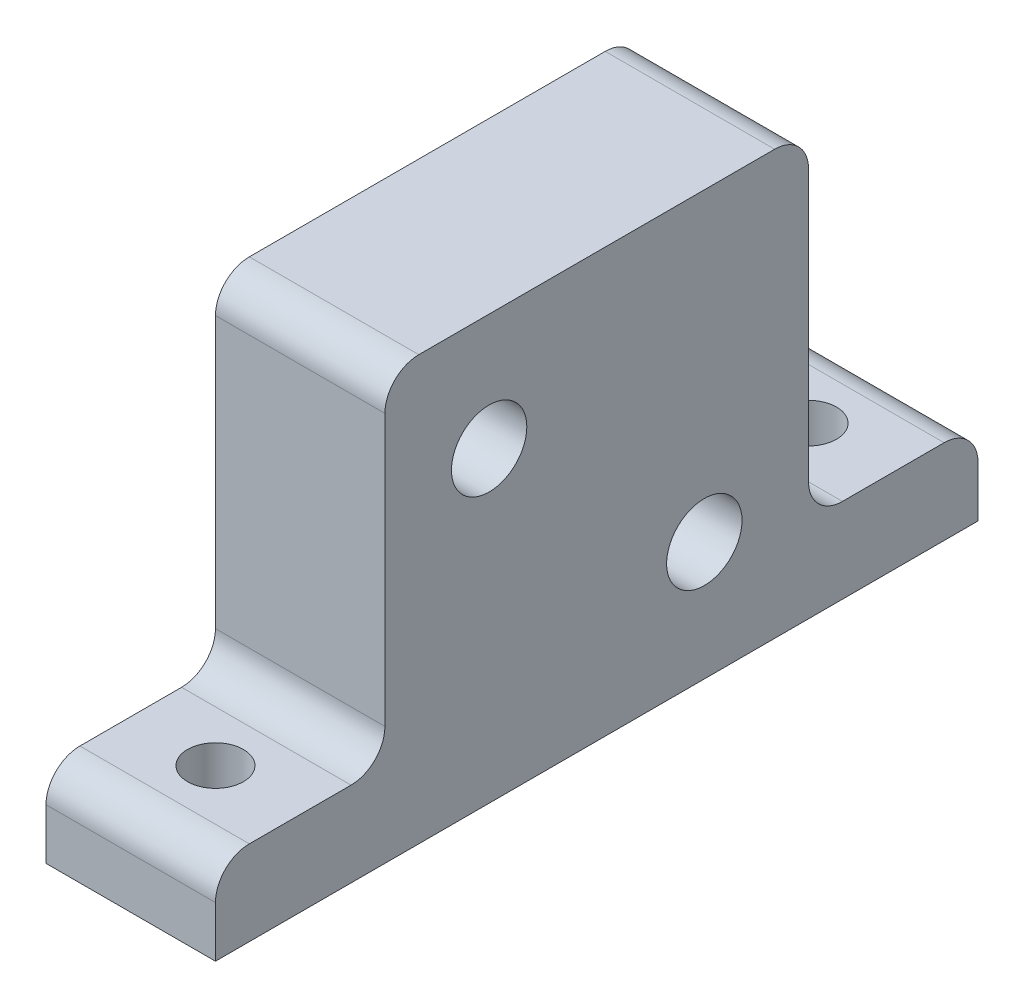
ISO-10303-21;
HEADER;
FILE_DESCRIPTION(('STEP AP214'),'2;1');
FILE_NAME('part.step','',(''),(''),'','','');
FILE_SCHEMA(('AUTOMOTIVE_DESIGN { 1 0 10303 214 1 1 1 1 }'));
ENDSEC;
DATA;
#1=APPLICATION_CONTEXT('core data for automotive mechanical design processes');
#2=APPLICATION_PROTOCOL_DEFINITION('international standard','automotive_design',2000,#1);
#3=PRODUCT_CONTEXT('',#1,'mechanical');
#4=PRODUCT('Part','Part','',(#3));
#5=PRODUCT_RELATED_PRODUCT_CATEGORY('part','',(#4));
#6=PRODUCT_DEFINITION_FORMATION('','',#4);
#7=PRODUCT_DEFINITION_CONTEXT('part definition',#1,'design');
#8=PRODUCT_DEFINITION('design','',#6,#7);
#9=PRODUCT_DEFINITION_SHAPE('','',#8);
#10=(LENGTH_UNIT() NAMED_UNIT(*) SI_UNIT(.MILLI.,.METRE.));
#11=(NAMED_UNIT(*) PLANE_ANGLE_UNIT() SI_UNIT($,.RADIAN.));
#12=(NAMED_UNIT(*) SI_UNIT($,.STERADIAN.) SOLID_ANGLE_UNIT());
#13=UNCERTAINTY_MEASURE_WITH_UNIT(LENGTH_MEASURE(1.E-05),#10,'distance_accuracy_value','');
#14=(GEOMETRIC_REPRESENTATION_CONTEXT(3) GLOBAL_UNCERTAINTY_ASSIGNED_CONTEXT((#13)) GLOBAL_UNIT_ASSIGNED_CONTEXT((#10,
#11,#12)) REPRESENTATION_CONTEXT('',''));
#15=CARTESIAN_POINT('',(0.,0.,0.));
#16=DIRECTION('',(0.,0.,1.));
#17=DIRECTION('',(1.,0.,0.));
#18=AXIS2_PLACEMENT_3D('',#15,#16,#17);
#19=CARTESIAN_POINT('',(105.,0.,122.5));
#20=DIRECTION('',(0.,0.,1.));
#21=DIRECTION('',(1.,0.,0.));
#22=AXIS2_PLACEMENT_3D('',#19,#20,#21);
#23=PLANE('',#22);
#24=DIRECTION('',(0.,1.,0.));
#25=VECTOR('',#24,1.);
#26=CARTESIAN_POINT('',(105.,0.,122.5));
#27=LINE('',#26,#25);
#28=CARTESIAN_POINT('',(105.,15.,122.5));
#29=VERTEX_POINT('',#28);
#30=CARTESIAN_POINT('',(105.,18.,122.5));
#31=VERTEX_POINT('',#30);
#32=EDGE_CURVE('E147',#29,#31,#27,.T.);
#33=ORIENTED_EDGE('',*,*,#32,.T.);
#34=DIRECTION('',(-1.,0.,0.));
#35=VECTOR('',#34,1.);
#36=CARTESIAN_POINT('',(105.,18.,122.5));
#37=LINE('',#36,#35);
#38=CARTESIAN_POINT('',(95.,18.,122.5));
#39=VERTEX_POINT('',#38);
#40=EDGE_CURVE('E263',#31,#39,#37,.T.);
#41=ORIENTED_EDGE('',*,*,#40,.T.);
#42=DIRECTION('',(0.,1.,0.));
#43=VECTOR('',#42,1.);
#44=CARTESIAN_POINT('',(95.,0.,122.5));
#45=LINE('',#44,#43);
#46=CARTESIAN_POINT('',(95.,15.,122.5));
#47=VERTEX_POINT('',#46);
#48=EDGE_CURVE('E150',#47,#39,#45,.T.);
#49=ORIENTED_EDGE('',*,*,#48,.F.);
#50=DIRECTION('',(-1.,0.,0.));
#51=VECTOR('',#50,1.);
#52=CARTESIAN_POINT('',(105.,15.,122.5));
#53=LINE('',#52,#51);
#54=EDGE_CURVE('E143',#29,#47,#53,.T.);
#55=ORIENTED_EDGE('',*,*,#54,.F.);
#56=EDGE_LOOP('',(#33,#41,#49,#55));
#57=FACE_BOUND('',#56,.T.);
#58=ADVANCED_FACE('F41',(#57),#23,.T.);
#59=CARTESIAN_POINT('',(105.,15.,0.));
#60=DIRECTION('',(0.,1.,0.));
#61=DIRECTION('',(0.,0.,1.));
#62=AXIS2_PLACEMENT_3D('',#59,#60,#61);
#63=PLANE('',#62);
#64=CARTESIAN_POINT('',(100.,15.,117.5));
#65=DIRECTION('',(0.,1.,0.));
#66=DIRECTION('',(0.,0.,1.));
#67=AXIS2_PLACEMENT_3D('',#64,#65,#66);
#68=CIRCLE('',#67,1.65);
#69=CARTESIAN_POINT('',(100.,15.,119.15));
#70=VERTEX_POINT('',#69);
#71=EDGE_CURVE('E543',#70,#70,#68,.T.);
#72=ORIENTED_EDGE('',*,*,#71,.T.);
#73=EDGE_LOOP('',(#72));
#74=FACE_BOUND('',#73,.T.);
#75=CARTESIAN_POINT('',(100.,15.,82.5));
#76=DIRECTION('',(0.,1.,0.));
#77=DIRECTION('',(0.,0.,1.));
#78=AXIS2_PLACEMENT_3D('',#75,#76,#77);
#79=CIRCLE('',#78,1.65);
#80=CARTESIAN_POINT('',(100.,15.,84.15));
#81=VERTEX_POINT('',#80);
#82=EDGE_CURVE('E175',#81,#81,#79,.T.);
#83=ORIENTED_EDGE('',*,*,#82,.T.);
#84=EDGE_LOOP('',(#83));
#85=FACE_BOUND('',#84,.T.);
#86=DIRECTION('',(0.,0.,-1.));
#87=VECTOR('',#86,1.);
#88=CARTESIAN_POINT('',(95.,15.,0.));
#89=LINE('',#88,#87);
#90=CARTESIAN_POINT('',(95.,15.,77.5));
#91=VERTEX_POINT('',#90);
#92=EDGE_CURVE('E199',#47,#91,#89,.T.);
#93=ORIENTED_EDGE('',*,*,#92,.T.);
#94=DIRECTION('',(-1.,0.,0.));
#95=VECTOR('',#94,1.);
#96=CARTESIAN_POINT('',(105.,15.,77.5));
#97=LINE('',#96,#95);
#98=CARTESIAN_POINT('',(105.,15.,77.5));
#99=VERTEX_POINT('',#98);
#100=EDGE_CURVE('E154',#99,#91,#97,.T.);
#101=ORIENTED_EDGE('',*,*,#100,.F.);
#102=DIRECTION('',(0.,0.,-1.));
#103=VECTOR('',#102,1.);
#104=CARTESIAN_POINT('',(105.,15.,0.));
#105=LINE('',#104,#103);
#106=EDGE_CURVE('E157',#29,#99,#105,.T.);
#107=ORIENTED_EDGE('',*,*,#106,.F.);
#108=ORIENTED_EDGE('',*,*,#54,.T.);
#109=EDGE_LOOP('',(#93,#101,#107,#108));
#110=FACE_BOUND('',#109,.T.);
#111=ADVANCED_FACE('F158',(#74,#85,#110),#63,.F.);
#112=CARTESIAN_POINT('',(105.,0.,77.5));
#113=DIRECTION('',(0.,0.,1.));
#114=DIRECTION('',(1.,0.,0.));
#115=AXIS2_PLACEMENT_3D('',#112,#113,#114);
#116=PLANE('',#115);
#117=DIRECTION('',(0.,1.,0.));
#118=VECTOR('',#117,1.);
#119=CARTESIAN_POINT('',(95.,0.,77.5));
#120=LINE('',#119,#118);
#121=CARTESIAN_POINT('',(95.,18.,77.5));
#122=VERTEX_POINT('',#121);
#123=EDGE_CURVE('E202',#91,#122,#120,.T.);
#124=ORIENTED_EDGE('',*,*,#123,.T.);
#125=DIRECTION('',(-1.,0.,0.));
#126=VECTOR('',#125,1.);
#127=CARTESIAN_POINT('',(105.,18.,77.5));
#128=LINE('',#127,#126);
#129=CARTESIAN_POINT('',(105.,18.,77.5));
#130=VERTEX_POINT('',#129);
#131=EDGE_CURVE('E251',#122,#130,#128,.F.);
#132=ORIENTED_EDGE('',*,*,#131,.T.);
#133=DIRECTION('',(0.,1.,0.));
#134=VECTOR('',#133,1.);
#135=CARTESIAN_POINT('',(105.,0.,77.5));
#136=LINE('',#135,#134);
#137=EDGE_CURVE('E162',#99,#130,#136,.T.);
#138=ORIENTED_EDGE('',*,*,#137,.F.);
#139=ORIENTED_EDGE('',*,*,#100,.T.);
#140=EDGE_LOOP('',(#124,#132,#138,#139));
#141=FACE_BOUND('',#140,.T.);
#142=ADVANCED_FACE('F288',(#141),#116,.F.);
#143=CARTESIAN_POINT('',(105.,20.,0.));
#144=DIRECTION('',(0.,-1.,0.));
#145=DIRECTION('',(0.,0.,-1.));
#146=AXIS2_PLACEMENT_3D('',#143,#144,#145);
#147=PLANE('',#146);
#148=CARTESIAN_POINT('',(100.,20.,82.5));
#149=DIRECTION('',(0.,-1.,0.));
#150=DIRECTION('',(0.,0.,-1.));
#151=AXIS2_PLACEMENT_3D('',#148,#149,#150);
#152=CIRCLE('',#151,1.65);
#153=CARTESIAN_POINT('',(100.,20.,80.8500000000001));
#154=VERTEX_POINT('',#153);
#155=EDGE_CURVE('E541',#154,#154,#152,.T.);
#156=ORIENTED_EDGE('',*,*,#155,.T.);
#157=EDGE_LOOP('',(#156));
#158=FACE_BOUND('',#157,.T.);
#159=DIRECTION('',(0.,0.,1.));
#160=VECTOR('',#159,1.);
#161=CARTESIAN_POINT('',(95.,20.,0.));
#162=LINE('',#161,#160);
#163=CARTESIAN_POINT('',(95.,20.,79.5));
#164=VERTEX_POINT('',#163);
#165=CARTESIAN_POINT('',(95.,20.,85.5));
#166=VERTEX_POINT('',#165);
#167=EDGE_CURVE('E205',#164,#166,#162,.T.);
#168=ORIENTED_EDGE('',*,*,#167,.T.);
#169=DIRECTION('',(-1.,0.,0.));
#170=VECTOR('',#169,1.);
#171=CARTESIAN_POINT('',(105.,20.,85.5));
#172=LINE('',#171,#170);
#173=CARTESIAN_POINT('',(105.,20.,85.5));
#174=VERTEX_POINT('',#173);
#175=EDGE_CURVE('E231',#166,#174,#172,.F.);
#176=ORIENTED_EDGE('',*,*,#175,.T.);
#177=DIRECTION('',(0.,0.,1.));
#178=VECTOR('',#177,1.);
#179=CARTESIAN_POINT('',(105.,20.,0.));
#180=LINE('',#179,#178);
#181=CARTESIAN_POINT('',(105.,20.,79.5));
#182=VERTEX_POINT('',#181);
#183=EDGE_CURVE('E179',#182,#174,#180,.T.);
#184=ORIENTED_EDGE('',*,*,#183,.F.);
#185=DIRECTION('',(-1.,0.,0.));
#186=VECTOR('',#185,1.);
#187=CARTESIAN_POINT('',(105.,20.,79.5));
#188=LINE('',#187,#186);
#189=EDGE_CURVE('E228',#182,#164,#188,.T.);
#190=ORIENTED_EDGE('',*,*,#189,.T.);
#191=EDGE_LOOP('',(#168,#176,#184,#190));
#192=FACE_BOUND('',#191,.T.);
#193=ADVANCED_FACE('F296',(#158,#192),#147,.F.);
#194=CARTESIAN_POINT('',(105.,0.,87.5));
#195=DIRECTION('',(0.,0.,1.));
#196=DIRECTION('',(1.,0.,0.));
#197=AXIS2_PLACEMENT_3D('',#194,#195,#196);
#198=PLANE('',#197);
#199=DIRECTION('',(0.,1.,0.));
#200=VECTOR('',#199,1.);
#201=CARTESIAN_POINT('',(105.,0.,87.5));
#202=LINE('',#201,#200);
#203=CARTESIAN_POINT('',(105.,22.,87.5));
#204=VERTEX_POINT('',#203);
#205=CARTESIAN_POINT('',(105.,38.,87.5));
#206=VERTEX_POINT('',#205);
#207=EDGE_CURVE('E182',#204,#206,#202,.T.);
#208=ORIENTED_EDGE('',*,*,#207,.F.);
#209=DIRECTION('',(-1.,0.,0.));
#210=VECTOR('',#209,1.);
#211=CARTESIAN_POINT('',(95.,22.,87.5));
#212=LINE('',#211,#210);
#213=CARTESIAN_POINT('',(95.,22.,87.5));
#214=VERTEX_POINT('',#213);
#215=EDGE_CURVE('E225',#204,#214,#212,.T.);
#216=ORIENTED_EDGE('',*,*,#215,.T.);
#217=DIRECTION('',(0.,1.,0.));
#218=VECTOR('',#217,1.);
#219=CARTESIAN_POINT('',(95.,0.,87.5));
#220=LINE('',#219,#218);
#221=CARTESIAN_POINT('',(95.,38.,87.5));
#222=VERTEX_POINT('',#221);
#223=EDGE_CURVE('E208',#214,#222,#220,.T.);
#224=ORIENTED_EDGE('',*,*,#223,.T.);
#225=DIRECTION('',(-1.,0.,0.));
#226=VECTOR('',#225,1.);
#227=CARTESIAN_POINT('',(105.,38.,87.5));
#228=LINE('',#227,#226);
#229=EDGE_CURVE('E153',#222,#206,#228,.F.);
#230=ORIENTED_EDGE('',*,*,#229,.T.);
#231=EDGE_LOOP('',(#208,#216,#224,#230));
#232=FACE_BOUND('',#231,.T.);
#233=ADVANCED_FACE('F305',(#232),#198,.F.);
#234=CARTESIAN_POINT('',(105.,40.,0.));
#235=DIRECTION('',(0.,1.,0.));
#236=DIRECTION('',(0.,0.,1.));
#237=AXIS2_PLACEMENT_3D('',#234,#235,#236);
#238=PLANE('',#237);
#239=DIRECTION('',(0.,0.,-1.));
#240=VECTOR('',#239,1.);
#241=CARTESIAN_POINT('',(105.,40.,0.));
#242=LINE('',#241,#240);
#243=CARTESIAN_POINT('',(105.,40.,110.5));
#244=VERTEX_POINT('',#243);
#245=CARTESIAN_POINT('',(105.,40.,89.5));
#246=VERTEX_POINT('',#245);
#247=EDGE_CURVE('E184',#244,#246,#242,.T.);
#248=ORIENTED_EDGE('',*,*,#247,.T.);
#249=DIRECTION('',(-1.,0.,0.));
#250=VECTOR('',#249,1.);
#251=CARTESIAN_POINT('',(95.,40.,89.5));
#252=LINE('',#251,#250);
#253=CARTESIAN_POINT('',(95.,40.,89.5));
#254=VERTEX_POINT('',#253);
#255=EDGE_CURVE('E260',#246,#254,#252,.T.);
#256=ORIENTED_EDGE('',*,*,#255,.T.);
#257=DIRECTION('',(0.,0.,-1.));
#258=VECTOR('',#257,1.);
#259=CARTESIAN_POINT('',(95.,40.,0.));
#260=LINE('',#259,#258);
#261=CARTESIAN_POINT('',(95.,40.,110.5));
#262=VERTEX_POINT('',#261);
#263=EDGE_CURVE('E211',#262,#254,#260,.T.);
#264=ORIENTED_EDGE('',*,*,#263,.F.);
#265=DIRECTION('',(-1.,0.,0.));
#266=VECTOR('',#265,1.);
#267=CARTESIAN_POINT('',(105.,40.,110.5));
#268=LINE('',#267,#266);
#269=EDGE_CURVE('E63',#262,#244,#268,.F.);
#270=ORIENTED_EDGE('',*,*,#269,.T.);
#271=EDGE_LOOP('',(#248,#256,#264,#270));
#272=FACE_BOUND('',#271,.T.);
#273=ADVANCED_FACE('F310',(#272),#238,.T.);
#274=CARTESIAN_POINT('',(105.,0.,112.5));
#275=DIRECTION('',(0.,0.,1.));
#276=DIRECTION('',(1.,0.,0.));
#277=AXIS2_PLACEMENT_3D('',#274,#275,#276);
#278=PLANE('',#277);
#279=DIRECTION('',(0.,1.,0.));
#280=VECTOR('',#279,1.);
#281=CARTESIAN_POINT('',(95.,0.,112.5));
#282=LINE('',#281,#280);
#283=CARTESIAN_POINT('',(95.,22.,112.5));
#284=VERTEX_POINT('',#283);
#285=CARTESIAN_POINT('',(95.,38.,112.5));
#286=VERTEX_POINT('',#285);
#287=EDGE_CURVE('E172',#284,#286,#282,.T.);
#288=ORIENTED_EDGE('',*,*,#287,.F.);
#289=DIRECTION('',(-1.,0.,0.));
#290=VECTOR('',#289,1.);
#291=CARTESIAN_POINT('',(105.,22.,112.5));
#292=LINE('',#291,#290);
#293=CARTESIAN_POINT('',(105.,22.,112.5));
#294=VERTEX_POINT('',#293);
#295=EDGE_CURVE('E241',#284,#294,#292,.F.);
#296=ORIENTED_EDGE('',*,*,#295,.T.);
#297=DIRECTION('',(0.,1.,0.));
#298=VECTOR('',#297,1.);
#299=CARTESIAN_POINT('',(105.,0.,112.5));
#300=LINE('',#299,#298);
#301=CARTESIAN_POINT('',(105.,38.,112.5));
#302=VERTEX_POINT('',#301);
#303=EDGE_CURVE('E186',#294,#302,#300,.T.);
#304=ORIENTED_EDGE('',*,*,#303,.T.);
#305=DIRECTION('',(-1.,0.,0.));
#306=VECTOR('',#305,1.);
#307=CARTESIAN_POINT('',(105.,38.,112.5));
#308=LINE('',#307,#306);
#309=EDGE_CURVE('E238',#302,#286,#308,.T.);
#310=ORIENTED_EDGE('',*,*,#309,.T.);
#311=EDGE_LOOP('',(#288,#296,#304,#310));
#312=FACE_BOUND('',#311,.T.);
#313=ADVANCED_FACE('F277',(#312),#278,.T.);
#314=CARTESIAN_POINT('',(105.,33.13,106.35));
#315=DIRECTION('',(-1.,0.,0.));
#316=DIRECTION('',(0.,0.,1.));
#317=AXIS2_PLACEMENT_3D('',#314,#315,#316);
#318=CYLINDRICAL_SURFACE('',#317,2.22500000000001);
#319=CARTESIAN_POINT('',(100.,33.13,106.35));
#320=DIRECTION('',(1.,0.,0.));
#321=DIRECTION('',(0.,0.,-1.));
#322=AXIS2_PLACEMENT_3D('',#319,#320,#321);
#323=CIRCLE('',#322,2.22500000000001);
#324=CARTESIAN_POINT('',(100.,33.13,104.125));
#325=VERTEX_POINT('',#324);
#326=EDGE_CURVE('E220',#325,#325,#323,.T.);
#327=ORIENTED_EDGE('',*,*,#326,.F.);
#328=EDGE_LOOP('',(#327));
#329=FACE_BOUND('',#328,.T.);
#330=CARTESIAN_POINT('',(105.,33.13,106.35));
#331=DIRECTION('',(1.,0.,0.));
#332=DIRECTION('',(0.,0.,-1.));
#333=AXIS2_PLACEMENT_3D('',#330,#331,#332);
#334=CIRCLE('',#333,2.22500000000001);
#335=CARTESIAN_POINT('',(105.,33.13,104.125));
#336=VERTEX_POINT('',#335);
#337=EDGE_CURVE('E192',#336,#336,#334,.T.);
#338=ORIENTED_EDGE('',*,*,#337,.T.);
#339=EDGE_LOOP('',(#338));
#340=FACE_BOUND('',#339,.T.);
#341=ADVANCED_FACE('F455',(#329,#340),#318,.F.);
#342=CARTESIAN_POINT('',(105.,20.,0.));
#343=DIRECTION('',(0.,1.,0.));
#344=DIRECTION('',(0.,0.,1.));
#345=AXIS2_PLACEMENT_3D('',#342,#343,#344);
#346=PLANE('',#345);
#347=CARTESIAN_POINT('',(100.,20.,117.5));
#348=DIRECTION('',(0.,1.,0.));
#349=DIRECTION('',(0.,0.,1.));
#350=AXIS2_PLACEMENT_3D('',#347,#348,#349);
#351=CIRCLE('',#350,1.65);
#352=CARTESIAN_POINT('',(100.,20.,119.15));
#353=VERTEX_POINT('',#352);
#354=EDGE_CURVE('E200',#353,#353,#351,.T.);
#355=ORIENTED_EDGE('',*,*,#354,.F.);
#356=EDGE_LOOP('',(#355));
#357=FACE_BOUND('',#356,.T.);
#358=DIRECTION('',(0.,0.,-1.));
#359=VECTOR('',#358,1.);
#360=CARTESIAN_POINT('',(105.,20.,0.));
#361=LINE('',#360,#359);
#362=CARTESIAN_POINT('',(105.,20.,120.5));
#363=VERTEX_POINT('',#362);
#364=CARTESIAN_POINT('',(105.,20.,114.5));
#365=VERTEX_POINT('',#364);
#366=EDGE_CURVE('E189',#363,#365,#361,.T.);
#367=ORIENTED_EDGE('',*,*,#366,.T.);
#368=DIRECTION('',(-1.,0.,0.));
#369=VECTOR('',#368,1.);
#370=CARTESIAN_POINT('',(95.,20.,114.5));
#371=LINE('',#370,#369);
#372=CARTESIAN_POINT('',(95.,20.,114.5));
#373=VERTEX_POINT('',#372);
#374=EDGE_CURVE('E235',#365,#373,#371,.T.);
#375=ORIENTED_EDGE('',*,*,#374,.T.);
#376=DIRECTION('',(0.,0.,-1.));
#377=VECTOR('',#376,1.);
#378=CARTESIAN_POINT('',(95.,20.,0.));
#379=LINE('',#378,#377);
#380=CARTESIAN_POINT('',(95.,20.,120.5));
#381=VERTEX_POINT('',#380);
#382=EDGE_CURVE('E169',#381,#373,#379,.T.);
#383=ORIENTED_EDGE('',*,*,#382,.F.);
#384=DIRECTION('',(-1.,0.,0.));
#385=VECTOR('',#384,1.);
#386=CARTESIAN_POINT('',(105.,20.,120.5));
#387=LINE('',#386,#385);
#388=EDGE_CURVE('E233',#381,#363,#387,.F.);
#389=ORIENTED_EDGE('',*,*,#388,.T.);
#390=EDGE_LOOP('',(#367,#375,#383,#389));
#391=FACE_BOUND('',#390,.T.);
#392=ADVANCED_FACE('F283',(#357,#391),#346,.T.);
#393=CARTESIAN_POINT('',(105.,22.,93.65));
#394=DIRECTION('',(-1.,0.,0.));
#395=DIRECTION('',(0.,0.,1.));
#396=AXIS2_PLACEMENT_3D('',#393,#394,#395);
#397=CYLINDRICAL_SURFACE('',#396,2.22500000000001);
#398=CARTESIAN_POINT('',(100.,22.,93.65));
#399=DIRECTION('',(1.,0.,0.));
#400=DIRECTION('',(0.,0.,-1.));
#401=AXIS2_PLACEMENT_3D('',#398,#399,#400);
#402=CIRCLE('',#401,2.22500000000001);
#403=CARTESIAN_POINT('',(100.,22.,91.425));
#404=VERTEX_POINT('',#403);
#405=EDGE_CURVE('E217',#404,#404,#402,.T.);
#406=ORIENTED_EDGE('',*,*,#405,.F.);
#407=EDGE_LOOP('',(#406));
#408=FACE_BOUND('',#407,.T.);
#409=CARTESIAN_POINT('',(105.,22.,93.65));
#410=DIRECTION('',(1.,0.,0.));
#411=DIRECTION('',(0.,0.,-1.));
#412=AXIS2_PLACEMENT_3D('',#409,#410,#411);
#413=CIRCLE('',#412,2.22500000000001);
#414=CARTESIAN_POINT('',(105.,22.,91.425));
#415=VERTEX_POINT('',#414);
#416=EDGE_CURVE('E195',#415,#415,#413,.T.);
#417=ORIENTED_EDGE('',*,*,#416,.T.);
#418=EDGE_LOOP('',(#417));
#419=FACE_BOUND('',#418,.T.);
#420=ADVANCED_FACE('F438',(#408,#419),#397,.F.);
#421=CARTESIAN_POINT('',(105.,0.,0.));
#422=DIRECTION('',(1.,0.,0.));
#423=DIRECTION('',(0.,0.,-1.));
#424=AXIS2_PLACEMENT_3D('',#421,#422,#423);
#425=PLANE('',#424);
#426=ORIENTED_EDGE('',*,*,#137,.T.);
#427=CARTESIAN_POINT('',(105.,18.,79.5));
#428=DIRECTION('',(1.,0.,0.));
#429=DIRECTION('',(0.,0.,-1.));
#430=AXIS2_PLACEMENT_3D('',#427,#428,#429);
#431=CIRCLE('',#430,2.);
#432=EDGE_CURVE('E257',#130,#182,#431,.T.);
#433=ORIENTED_EDGE('',*,*,#432,.T.);
#434=ORIENTED_EDGE('',*,*,#183,.T.);
#435=CARTESIAN_POINT('',(105.,22.,85.5));
#436=DIRECTION('',(1.,0.,0.));
#437=DIRECTION('',(0.,0.,-1.));
#438=AXIS2_PLACEMENT_3D('',#435,#436,#437);
#439=CIRCLE('',#438,2.);
#440=EDGE_CURVE('E267',#174,#204,#439,.F.);
#441=ORIENTED_EDGE('',*,*,#440,.T.);
#442=ORIENTED_EDGE('',*,*,#207,.T.);
#443=CARTESIAN_POINT('',(105.,38.,89.5));
#444=DIRECTION('',(1.,0.,0.));
#445=DIRECTION('',(0.,0.,-1.));
#446=AXIS2_PLACEMENT_3D('',#443,#444,#445);
#447=CIRCLE('',#446,2.);
#448=EDGE_CURVE('E56',#206,#246,#447,.T.);
#449=ORIENTED_EDGE('',*,*,#448,.T.);
#450=ORIENTED_EDGE('',*,*,#247,.F.);
#451=CARTESIAN_POINT('',(105.,38.,110.5));
#452=DIRECTION('',(1.,0.,0.));
#453=DIRECTION('',(0.,0.,-1.));
#454=AXIS2_PLACEMENT_3D('',#451,#452,#453);
#455=CIRCLE('',#454,2.);
#456=EDGE_CURVE('E254',#244,#302,#455,.T.);
#457=ORIENTED_EDGE('',*,*,#456,.T.);
#458=ORIENTED_EDGE('',*,*,#303,.F.);
#459=CARTESIAN_POINT('',(105.,22.,114.5));
#460=DIRECTION('',(1.,0.,0.));
#461=DIRECTION('',(0.,0.,-1.));
#462=AXIS2_PLACEMENT_3D('',#459,#460,#461);
#463=CIRCLE('',#462,2.);
#464=EDGE_CURVE('E11',#294,#365,#463,.F.);
#465=ORIENTED_EDGE('',*,*,#464,.T.);
#466=ORIENTED_EDGE('',*,*,#366,.F.);
#467=CARTESIAN_POINT('',(105.,18.,120.5));
#468=DIRECTION('',(1.,0.,0.));
#469=DIRECTION('',(0.,0.,-1.));
#470=AXIS2_PLACEMENT_3D('',#467,#468,#469);
#471=CIRCLE('',#470,2.);
#472=EDGE_CURVE('E168',#363,#31,#471,.T.);
#473=ORIENTED_EDGE('',*,*,#472,.T.);
#474=ORIENTED_EDGE('',*,*,#32,.F.);
#475=ORIENTED_EDGE('',*,*,#106,.T.);
#476=EDGE_LOOP('',(#426,#433,#434,#441,#442,#449,#450,#457,#458,#465,#466,#473,#474,#475));
#477=FACE_BOUND('',#476,.T.);
#478=ORIENTED_EDGE('',*,*,#337,.F.);
#479=EDGE_LOOP('',(#478));
#480=FACE_BOUND('',#479,.T.);
#481=ORIENTED_EDGE('',*,*,#416,.F.);
#482=EDGE_LOOP('',(#481));
#483=FACE_BOUND('',#482,.T.);
#484=ADVANCED_FACE('F164',(#477,#480,#483),#425,.T.);
#485=CARTESIAN_POINT('',(95.,0.,0.));
#486=DIRECTION('',(1.,0.,0.));
#487=DIRECTION('',(0.,0.,-1.));
#488=AXIS2_PLACEMENT_3D('',#485,#486,#487);
#489=PLANE('',#488);
#490=CARTESIAN_POINT('',(95.,22.,93.65));
#491=DIRECTION('',(1.,0.,0.));
#492=DIRECTION('',(0.,0.,-1.));
#493=AXIS2_PLACEMENT_3D('',#490,#491,#492);
#494=CIRCLE('',#493,3.93499999999999);
#495=CARTESIAN_POINT('',(95.,22.,89.715));
#496=VERTEX_POINT('',#495);
#497=EDGE_CURVE('E556',#496,#496,#494,.T.);
#498=ORIENTED_EDGE('',*,*,#497,.T.);
#499=EDGE_LOOP('',(#498));
#500=FACE_BOUND('',#499,.T.);
#501=CARTESIAN_POINT('',(95.,33.13,106.35));
#502=DIRECTION('',(1.,0.,0.));
#503=DIRECTION('',(0.,0.,-1.));
#504=AXIS2_PLACEMENT_3D('',#501,#502,#503);
#505=CIRCLE('',#504,3.93499999999999);
#506=CARTESIAN_POINT('',(95.,33.13,102.415));
#507=VERTEX_POINT('',#506);
#508=EDGE_CURVE('E553',#507,#507,#505,.T.);
#509=ORIENTED_EDGE('',*,*,#508,.T.);
#510=EDGE_LOOP('',(#509));
#511=FACE_BOUND('',#510,.T.);
#512=ORIENTED_EDGE('',*,*,#167,.F.);
#513=CARTESIAN_POINT('',(95.,18.,79.5));
#514=DIRECTION('',(1.,0.,0.));
#515=DIRECTION('',(0.,0.,-1.));
#516=AXIS2_PLACEMENT_3D('',#513,#514,#515);
#517=CIRCLE('',#516,2.);
#518=EDGE_CURVE('E249',#164,#122,#517,.F.);
#519=ORIENTED_EDGE('',*,*,#518,.T.);
#520=ORIENTED_EDGE('',*,*,#123,.F.);
#521=ORIENTED_EDGE('',*,*,#92,.F.);
#522=ORIENTED_EDGE('',*,*,#48,.T.);
#523=CARTESIAN_POINT('',(95.,18.,120.5));
#524=DIRECTION('',(1.,0.,0.));
#525=DIRECTION('',(0.,0.,-1.));
#526=AXIS2_PLACEMENT_3D('',#523,#524,#525);
#527=CIRCLE('',#526,2.);
#528=EDGE_CURVE('E243',#39,#381,#527,.F.);
#529=ORIENTED_EDGE('',*,*,#528,.T.);
#530=ORIENTED_EDGE('',*,*,#382,.T.);
#531=CARTESIAN_POINT('',(95.,22.,114.5));
#532=DIRECTION('',(1.,0.,0.));
#533=DIRECTION('',(0.,0.,-1.));
#534=AXIS2_PLACEMENT_3D('',#531,#532,#533);
#535=CIRCLE('',#534,2.);
#536=EDGE_CURVE('E49',#373,#284,#535,.T.);
#537=ORIENTED_EDGE('',*,*,#536,.T.);
#538=ORIENTED_EDGE('',*,*,#287,.T.);
#539=CARTESIAN_POINT('',(95.,38.,110.5));
#540=DIRECTION('',(1.,0.,0.));
#541=DIRECTION('',(0.,0.,-1.));
#542=AXIS2_PLACEMENT_3D('',#539,#540,#541);
#543=CIRCLE('',#542,2.);
#544=EDGE_CURVE('E245',#286,#262,#543,.F.);
#545=ORIENTED_EDGE('',*,*,#544,.T.);
#546=ORIENTED_EDGE('',*,*,#263,.T.);
#547=CARTESIAN_POINT('',(95.,38.,89.5));
#548=DIRECTION('',(1.,0.,0.));
#549=DIRECTION('',(0.,0.,-1.));
#550=AXIS2_PLACEMENT_3D('',#547,#548,#549);
#551=CIRCLE('',#550,2.);
#552=EDGE_CURVE('E247',#254,#222,#551,.F.);
#553=ORIENTED_EDGE('',*,*,#552,.T.);
#554=ORIENTED_EDGE('',*,*,#223,.F.);
#555=CARTESIAN_POINT('',(95.,22.,85.5));
#556=DIRECTION('',(1.,0.,0.));
#557=DIRECTION('',(0.,0.,-1.));
#558=AXIS2_PLACEMENT_3D('',#555,#556,#557);
#559=CIRCLE('',#558,2.);
#560=EDGE_CURVE('E265',#214,#166,#559,.T.);
#561=ORIENTED_EDGE('',*,*,#560,.T.);
#562=EDGE_LOOP('',(#512,#519,#520,#521,#522,#529,#530,#537,#538,#545,#546,#553,#554,#561));
#563=FACE_BOUND('',#562,.T.);
#564=ADVANCED_FACE('F271',(#500,#511,#563),#489,.F.);
#565=CARTESIAN_POINT('',(100.,40.001,117.5));
#566=DIRECTION('',(0.,-1.,0.));
#567=DIRECTION('',(0.,0.,-1.));
#568=AXIS2_PLACEMENT_3D('',#565,#566,#567);
#569=CYLINDRICAL_SURFACE('',#568,1.65);
#570=ORIENTED_EDGE('',*,*,#354,.T.);
#571=EDGE_LOOP('',(#570));
#572=FACE_BOUND('',#571,.T.);
#573=ORIENTED_EDGE('',*,*,#71,.F.);
#574=EDGE_LOOP('',(#573));
#575=FACE_BOUND('',#574,.T.);
#576=ADVANCED_FACE('F410',(#572,#575),#569,.F.);
#577=CARTESIAN_POINT('',(100.,40.001,82.5));
#578=DIRECTION('',(0.,-1.,0.));
#579=DIRECTION('',(0.,0.,-1.));
#580=AXIS2_PLACEMENT_3D('',#577,#578,#579);
#581=CYLINDRICAL_SURFACE('',#580,1.65);
#582=ORIENTED_EDGE('',*,*,#82,.F.);
#583=EDGE_LOOP('',(#582));
#584=FACE_BOUND('',#583,.T.);
#585=ORIENTED_EDGE('',*,*,#155,.F.);
#586=EDGE_LOOP('',(#585));
#587=FACE_BOUND('',#586,.T.);
#588=ADVANCED_FACE('F401',(#584,#587),#581,.F.);
#589=CARTESIAN_POINT('',(100.,33.13,106.35));
#590=DIRECTION('',(-1.,0.,0.));
#591=DIRECTION('',(0.,0.,1.));
#592=AXIS2_PLACEMENT_3D('',#589,#590,#591);
#593=CYLINDRICAL_SURFACE('',#592,3.93499999999999);
#594=CARTESIAN_POINT('',(100.,33.13,106.35));
#595=DIRECTION('',(1.,0.,0.));
#596=DIRECTION('',(0.,0.,-1.));
#597=AXIS2_PLACEMENT_3D('',#594,#595,#596);
#598=CIRCLE('',#597,3.93499999999999);
#599=CARTESIAN_POINT('',(100.,33.13,102.415));
#600=VERTEX_POINT('',#599);
#601=EDGE_CURVE('E550',#600,#600,#598,.T.);
#602=ORIENTED_EDGE('',*,*,#601,.T.);
#603=EDGE_LOOP('',(#602));
#604=FACE_BOUND('',#603,.T.);
#605=ORIENTED_EDGE('',*,*,#508,.F.);
#606=EDGE_LOOP('',(#605));
#607=FACE_BOUND('',#606,.T.);
#608=ADVANCED_FACE('F392',(#604,#607),#593,.F.);
#609=CARTESIAN_POINT('',(100.,33.13,106.35));
#610=DIRECTION('',(1.,0.,0.));
#611=DIRECTION('',(0.,0.,-1.));
#612=AXIS2_PLACEMENT_3D('',#609,#610,#611);
#613=PLANE('',#612);
#614=ORIENTED_EDGE('',*,*,#326,.T.);
#615=EDGE_LOOP('',(#614));
#616=FACE_BOUND('',#615,.T.);
#617=ORIENTED_EDGE('',*,*,#601,.F.);
#618=EDGE_LOOP('',(#617));
#619=FACE_BOUND('',#618,.T.);
#620=ADVANCED_FACE('F383',(#616,#619),#613,.F.);
#621=CARTESIAN_POINT('',(100.,22.,93.65));
#622=DIRECTION('',(-1.,0.,0.));
#623=DIRECTION('',(0.,0.,1.));
#624=AXIS2_PLACEMENT_3D('',#621,#622,#623);
#625=CYLINDRICAL_SURFACE('',#624,3.93499999999999);
#626=CARTESIAN_POINT('',(100.,22.,93.65));
#627=DIRECTION('',(1.,0.,0.));
#628=DIRECTION('',(0.,0.,-1.));
#629=AXIS2_PLACEMENT_3D('',#626,#627,#628);
#630=CIRCLE('',#629,3.93499999999999);
#631=CARTESIAN_POINT('',(100.,22.,89.715));
#632=VERTEX_POINT('',#631);
#633=EDGE_CURVE('E221',#632,#632,#630,.T.);
#634=ORIENTED_EDGE('',*,*,#633,.T.);
#635=EDGE_LOOP('',(#634));
#636=FACE_BOUND('',#635,.T.);
#637=ORIENTED_EDGE('',*,*,#497,.F.);
#638=EDGE_LOOP('',(#637));
#639=FACE_BOUND('',#638,.T.);
#640=ADVANCED_FACE('F374',(#636,#639),#625,.F.);
#641=CARTESIAN_POINT('',(100.,22.,93.65));
#642=DIRECTION('',(1.,0.,0.));
#643=DIRECTION('',(0.,0.,-1.));
#644=AXIS2_PLACEMENT_3D('',#641,#642,#643);
#645=PLANE('',#644);
#646=ORIENTED_EDGE('',*,*,#405,.T.);
#647=EDGE_LOOP('',(#646));
#648=FACE_BOUND('',#647,.T.);
#649=ORIENTED_EDGE('',*,*,#633,.F.);
#650=EDGE_LOOP('',(#649));
#651=FACE_BOUND('',#650,.T.);
#652=ADVANCED_FACE('F333',(#648,#651),#645,.F.);
#653=CARTESIAN_POINT('',(105.,22.,85.5));
#654=DIRECTION('',(1.,0.,0.));
#655=DIRECTION('',(0.,0.,-1.));
#656=AXIS2_PLACEMENT_3D('',#653,#654,#655);
#657=CYLINDRICAL_SURFACE('',#656,2.);
#658=ORIENTED_EDGE('',*,*,#440,.F.);
#659=ORIENTED_EDGE('',*,*,#175,.F.);
#660=ORIENTED_EDGE('',*,*,#560,.F.);
#661=ORIENTED_EDGE('',*,*,#215,.F.);
#662=EDGE_LOOP('',(#658,#659,#660,#661));
#663=FACE_BOUND('',#662,.T.);
#664=ADVANCED_FACE('F302',(#663),#657,.F.);
#665=CARTESIAN_POINT('',(105.,22.,114.5));
#666=DIRECTION('',(1.,0.,0.));
#667=DIRECTION('',(0.,0.,-1.));
#668=AXIS2_PLACEMENT_3D('',#665,#666,#667);
#669=CYLINDRICAL_SURFACE('',#668,2.);
#670=ORIENTED_EDGE('',*,*,#464,.F.);
#671=ORIENTED_EDGE('',*,*,#295,.F.);
#672=ORIENTED_EDGE('',*,*,#536,.F.);
#673=ORIENTED_EDGE('',*,*,#374,.F.);
#674=EDGE_LOOP('',(#670,#671,#672,#673));
#675=FACE_BOUND('',#674,.T.);
#676=ADVANCED_FACE('F281',(#675),#669,.F.);
#677=CARTESIAN_POINT('',(105.,18.,79.5));
#678=DIRECTION('',(-1.,0.,0.));
#679=DIRECTION('',(0.,0.,1.));
#680=AXIS2_PLACEMENT_3D('',#677,#678,#679);
#681=CYLINDRICAL_SURFACE('',#680,2.);
#682=ORIENTED_EDGE('',*,*,#432,.F.);
#683=ORIENTED_EDGE('',*,*,#131,.F.);
#684=ORIENTED_EDGE('',*,*,#518,.F.);
#685=ORIENTED_EDGE('',*,*,#189,.F.);
#686=EDGE_LOOP('',(#682,#683,#684,#685));
#687=FACE_BOUND('',#686,.T.);
#688=ADVANCED_FACE('F294',(#687),#681,.T.);
#689=CARTESIAN_POINT('',(105.,38.,89.5));
#690=DIRECTION('',(1.,0.,0.));
#691=DIRECTION('',(0.,0.,-1.));
#692=AXIS2_PLACEMENT_3D('',#689,#690,#691);
#693=CYLINDRICAL_SURFACE('',#692,2.);
#694=ORIENTED_EDGE('',*,*,#448,.F.);
#695=ORIENTED_EDGE('',*,*,#229,.F.);
#696=ORIENTED_EDGE('',*,*,#552,.F.);
#697=ORIENTED_EDGE('',*,*,#255,.F.);
#698=EDGE_LOOP('',(#694,#695,#696,#697));
#699=FACE_BOUND('',#698,.T.);
#700=ADVANCED_FACE('F309',(#699),#693,.T.);
#701=CARTESIAN_POINT('',(105.,38.,110.5));
#702=DIRECTION('',(-1.,0.,0.));
#703=DIRECTION('',(0.,0.,1.));
#704=AXIS2_PLACEMENT_3D('',#701,#702,#703);
#705=CYLINDRICAL_SURFACE('',#704,2.);
#706=ORIENTED_EDGE('',*,*,#456,.F.);
#707=ORIENTED_EDGE('',*,*,#269,.F.);
#708=ORIENTED_EDGE('',*,*,#544,.F.);
#709=ORIENTED_EDGE('',*,*,#309,.F.);
#710=EDGE_LOOP('',(#706,#707,#708,#709));
#711=FACE_BOUND('',#710,.T.);
#712=ADVANCED_FACE('F313',(#711),#705,.T.);
#713=CARTESIAN_POINT('',(105.,18.,120.5));
#714=DIRECTION('',(-1.,0.,0.));
#715=DIRECTION('',(0.,0.,1.));
#716=AXIS2_PLACEMENT_3D('',#713,#714,#715);
#717=CYLINDRICAL_SURFACE('',#716,2.);
#718=ORIENTED_EDGE('',*,*,#472,.F.);
#719=ORIENTED_EDGE('',*,*,#388,.F.);
#720=ORIENTED_EDGE('',*,*,#528,.F.);
#721=ORIENTED_EDGE('',*,*,#40,.F.);
#722=EDGE_LOOP('',(#718,#719,#720,#721));
#723=FACE_BOUND('',#722,.T.);
#724=ADVANCED_FACE('F43',(#723),#717,.T.);
#725=CLOSED_SHELL('',(#58,#111,#142,#193,#233,#273,#313,#341,#392,#420,#484,#564,#576,#588,#608,
#620,#640,#652,#664,#676,#688,#700,#712,#724));
#726=MANIFOLD_SOLID_BREP('B2',#725);
#727=ADVANCED_BREP_SHAPE_REPRESENTATION('',(#18,#726),#14);
#728=SHAPE_DEFINITION_REPRESENTATION(#9,#727);
ENDSEC;
END-ISO-10303-21;
